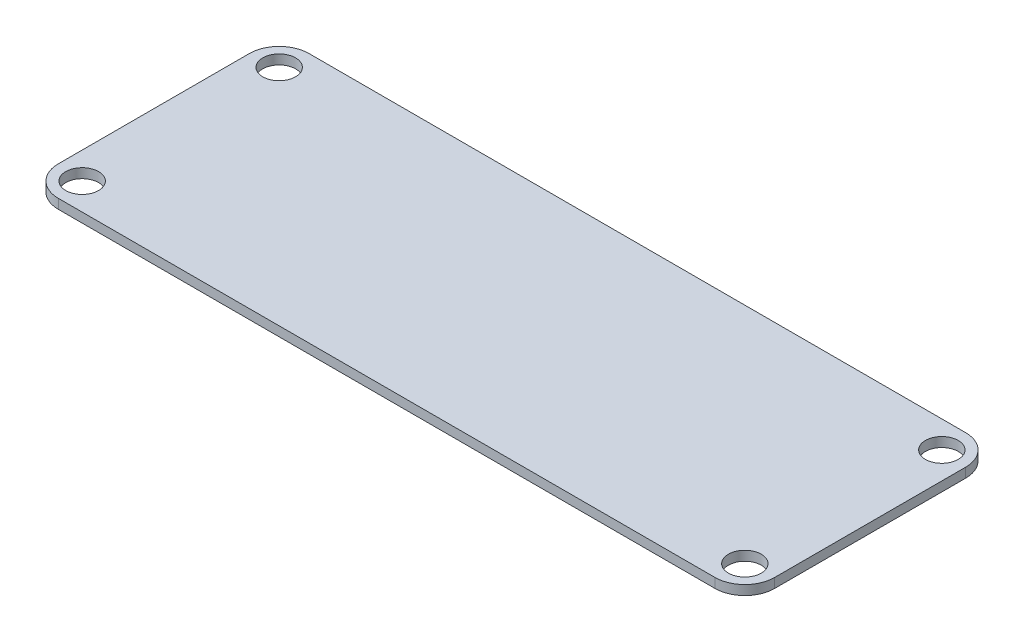
ISO-10303-21;
HEADER;
FILE_DESCRIPTION(('STEP AP214'),'2;1');
FILE_NAME('part.step','',(''),(''),'','','');
FILE_SCHEMA(('AUTOMOTIVE_DESIGN { 1 0 10303 214 1 1 1 1 }'));
ENDSEC;
DATA;
#1=APPLICATION_CONTEXT('core data for automotive mechanical design processes');
#2=APPLICATION_PROTOCOL_DEFINITION('international standard','automotive_design',2000,#1);
#3=PRODUCT_CONTEXT('',#1,'mechanical');
#4=PRODUCT('Part','Part','',(#3));
#5=PRODUCT_RELATED_PRODUCT_CATEGORY('part','',(#4));
#6=PRODUCT_DEFINITION_FORMATION('','',#4);
#7=PRODUCT_DEFINITION_CONTEXT('part definition',#1,'design');
#8=PRODUCT_DEFINITION('design','',#6,#7);
#9=PRODUCT_DEFINITION_SHAPE('','',#8);
#10=(LENGTH_UNIT() NAMED_UNIT(*) SI_UNIT(.MILLI.,.METRE.));
#11=(NAMED_UNIT(*) PLANE_ANGLE_UNIT() SI_UNIT($,.RADIAN.));
#12=(NAMED_UNIT(*) SI_UNIT($,.STERADIAN.) SOLID_ANGLE_UNIT());
#13=UNCERTAINTY_MEASURE_WITH_UNIT(LENGTH_MEASURE(1.E-05),#10,'distance_accuracy_value','');
#14=(GEOMETRIC_REPRESENTATION_CONTEXT(3) GLOBAL_UNCERTAINTY_ASSIGNED_CONTEXT((#13)) GLOBAL_UNIT_ASSIGNED_CONTEXT((#10,
#11,#12)) REPRESENTATION_CONTEXT('',''));
#15=CARTESIAN_POINT('',(0.,0.,0.));
#16=DIRECTION('',(0.,0.,1.));
#17=DIRECTION('',(1.,0.,0.));
#18=AXIS2_PLACEMENT_3D('',#15,#16,#17);
#19=CARTESIAN_POINT('',(-55.,1.6,16.));
#20=DIRECTION('',(0.,-1.,0.));
#21=DIRECTION('',(0.,0.,-1.));
#22=AXIS2_PLACEMENT_3D('',#19,#20,#21);
#23=CYLINDRICAL_SURFACE('',#22,5.);
#24=CARTESIAN_POINT('',(-55.,0.,16.));
#25=DIRECTION('',(0.,1.,0.));
#26=DIRECTION('',(0.,0.,1.));
#27=AXIS2_PLACEMENT_3D('',#24,#25,#26);
#28=CIRCLE('',#27,5.);
#29=CARTESIAN_POINT('',(-60.,0.,16.));
#30=VERTEX_POINT('',#29);
#31=CARTESIAN_POINT('',(-55.,0.,21.));
#32=VERTEX_POINT('',#31);
#33=EDGE_CURVE('E128',#30,#32,#28,.T.);
#34=ORIENTED_EDGE('',*,*,#33,.T.);
#35=DIRECTION('',(0.,-1.,0.));
#36=VECTOR('',#35,1.);
#37=CARTESIAN_POINT('',(-55.,1.6,21.));
#38=LINE('',#37,#36);
#39=CARTESIAN_POINT('',(-55.,1.6,21.));
#40=VERTEX_POINT('',#39);
#41=EDGE_CURVE('E11',#40,#32,#38,.T.);
#42=ORIENTED_EDGE('',*,*,#41,.F.);
#43=CARTESIAN_POINT('',(-55.,1.6,16.));
#44=DIRECTION('',(0.,1.,0.));
#45=DIRECTION('',(0.,0.,1.));
#46=AXIS2_PLACEMENT_3D('',#43,#44,#45);
#47=CIRCLE('',#46,5.);
#48=CARTESIAN_POINT('',(-60.,1.6,16.));
#49=VERTEX_POINT('',#48);
#50=EDGE_CURVE('E143',#49,#40,#47,.T.);
#51=ORIENTED_EDGE('',*,*,#50,.F.);
#52=DIRECTION('',(0.,-1.,0.));
#53=VECTOR('',#52,1.);
#54=CARTESIAN_POINT('',(-60.,1.6,16.));
#55=LINE('',#54,#53);
#56=EDGE_CURVE('E124',#49,#30,#55,.T.);
#57=ORIENTED_EDGE('',*,*,#56,.T.);
#58=EDGE_LOOP('',(#34,#42,#51,#57));
#59=FACE_BOUND('',#58,.T.);
#60=ADVANCED_FACE('F32',(#59),#23,.T.);
#61=CARTESIAN_POINT('',(-55.,1.6,21.));
#62=DIRECTION('',(0.,0.,-1.));
#63=DIRECTION('',(-1.,0.,0.));
#64=AXIS2_PLACEMENT_3D('',#61,#62,#63);
#65=PLANE('',#64);
#66=DIRECTION('',(1.,0.,0.));
#67=VECTOR('',#66,1.);
#68=CARTESIAN_POINT('',(-55.,0.,21.));
#69=LINE('',#68,#67);
#70=CARTESIAN_POINT('',(55.,0.,21.));
#71=VERTEX_POINT('',#70);
#72=EDGE_CURVE('E131',#32,#71,#69,.T.);
#73=ORIENTED_EDGE('',*,*,#72,.T.);
#74=DIRECTION('',(0.,-1.,0.));
#75=VECTOR('',#74,1.);
#76=CARTESIAN_POINT('',(55.,1.6,21.));
#77=LINE('',#76,#75);
#78=CARTESIAN_POINT('',(55.,1.6,21.));
#79=VERTEX_POINT('',#78);
#80=EDGE_CURVE('E40',#79,#71,#77,.T.);
#81=ORIENTED_EDGE('',*,*,#80,.F.);
#82=DIRECTION('',(1.,0.,0.));
#83=VECTOR('',#82,1.);
#84=CARTESIAN_POINT('',(-55.,1.6,21.));
#85=LINE('',#84,#83);
#86=EDGE_CURVE('E91',#40,#79,#85,.T.);
#87=ORIENTED_EDGE('',*,*,#86,.F.);
#88=ORIENTED_EDGE('',*,*,#41,.T.);
#89=EDGE_LOOP('',(#73,#81,#87,#88));
#90=FACE_BOUND('',#89,.T.);
#91=ADVANCED_FACE('F229',(#90),#65,.F.);
#92=CARTESIAN_POINT('',(55.,1.6,16.));
#93=DIRECTION('',(0.,-1.,0.));
#94=DIRECTION('',(0.,0.,-1.));
#95=AXIS2_PLACEMENT_3D('',#92,#93,#94);
#96=CYLINDRICAL_SURFACE('',#95,5.);
#97=CARTESIAN_POINT('',(55.,0.,16.));
#98=DIRECTION('',(0.,1.,0.));
#99=DIRECTION('',(0.,0.,1.));
#100=AXIS2_PLACEMENT_3D('',#97,#98,#99);
#101=CIRCLE('',#100,5.);
#102=CARTESIAN_POINT('',(60.,0.,16.));
#103=VERTEX_POINT('',#102);
#104=EDGE_CURVE('E134',#71,#103,#101,.T.);
#105=ORIENTED_EDGE('',*,*,#104,.T.);
#106=DIRECTION('',(0.,-1.,0.));
#107=VECTOR('',#106,1.);
#108=CARTESIAN_POINT('',(60.,1.6,16.));
#109=LINE('',#108,#107);
#110=CARTESIAN_POINT('',(60.,1.6,16.));
#111=VERTEX_POINT('',#110);
#112=EDGE_CURVE('E150',#111,#103,#109,.T.);
#113=ORIENTED_EDGE('',*,*,#112,.F.);
#114=CARTESIAN_POINT('',(55.,1.6,16.));
#115=DIRECTION('',(0.,1.,0.));
#116=DIRECTION('',(0.,0.,1.));
#117=AXIS2_PLACEMENT_3D('',#114,#115,#116);
#118=CIRCLE('',#117,5.);
#119=EDGE_CURVE('E158',#79,#111,#118,.T.);
#120=ORIENTED_EDGE('',*,*,#119,.F.);
#121=ORIENTED_EDGE('',*,*,#80,.T.);
#122=EDGE_LOOP('',(#105,#113,#120,#121));
#123=FACE_BOUND('',#122,.T.);
#124=ADVANCED_FACE('F156',(#123),#96,.T.);
#125=CARTESIAN_POINT('',(60.,1.6,-16.));
#126=DIRECTION('',(-1.,0.,0.));
#127=DIRECTION('',(0.,0.,1.));
#128=AXIS2_PLACEMENT_3D('',#125,#126,#127);
#129=PLANE('',#128);
#130=DIRECTION('',(0.,0.,-1.));
#131=VECTOR('',#130,1.);
#132=CARTESIAN_POINT('',(60.,0.,-16.));
#133=LINE('',#132,#131);
#134=CARTESIAN_POINT('',(60.,0.,-16.));
#135=VERTEX_POINT('',#134);
#136=EDGE_CURVE('E136',#103,#135,#133,.T.);
#137=ORIENTED_EDGE('',*,*,#136,.T.);
#138=DIRECTION('',(0.,-1.,0.));
#139=VECTOR('',#138,1.);
#140=CARTESIAN_POINT('',(60.,1.6,-16.));
#141=LINE('',#140,#139);
#142=CARTESIAN_POINT('',(60.,1.6,-16.));
#143=VERTEX_POINT('',#142);
#144=EDGE_CURVE('E147',#143,#135,#141,.T.);
#145=ORIENTED_EDGE('',*,*,#144,.F.);
#146=DIRECTION('',(0.,0.,-1.));
#147=VECTOR('',#146,1.);
#148=CARTESIAN_POINT('',(60.,1.6,-16.));
#149=LINE('',#148,#147);
#150=EDGE_CURVE('E170',#111,#143,#149,.T.);
#151=ORIENTED_EDGE('',*,*,#150,.F.);
#152=ORIENTED_EDGE('',*,*,#112,.T.);
#153=EDGE_LOOP('',(#137,#145,#151,#152));
#154=FACE_BOUND('',#153,.T.);
#155=ADVANCED_FACE('F166',(#154),#129,.F.);
#156=CARTESIAN_POINT('',(55.,1.6,-16.));
#157=DIRECTION('',(0.,-1.,0.));
#158=DIRECTION('',(0.,0.,-1.));
#159=AXIS2_PLACEMENT_3D('',#156,#157,#158);
#160=CYLINDRICAL_SURFACE('',#159,5.);
#161=CARTESIAN_POINT('',(55.,0.,-16.));
#162=DIRECTION('',(0.,1.,0.));
#163=DIRECTION('',(0.,0.,-1.));
#164=AXIS2_PLACEMENT_3D('',#161,#162,#163);
#165=CIRCLE('',#164,5.);
#166=CARTESIAN_POINT('',(55.,0.,-21.));
#167=VERTEX_POINT('',#166);
#168=EDGE_CURVE('E138',#135,#167,#165,.T.);
#169=ORIENTED_EDGE('',*,*,#168,.T.);
#170=DIRECTION('',(0.,-1.,0.));
#171=VECTOR('',#170,1.);
#172=CARTESIAN_POINT('',(55.,1.6,-21.));
#173=LINE('',#172,#171);
#174=CARTESIAN_POINT('',(55.,1.6,-21.));
#175=VERTEX_POINT('',#174);
#176=EDGE_CURVE('E119',#175,#167,#173,.T.);
#177=ORIENTED_EDGE('',*,*,#176,.F.);
#178=CARTESIAN_POINT('',(55.,1.6,-16.));
#179=DIRECTION('',(0.,1.,0.));
#180=DIRECTION('',(0.,0.,-1.));
#181=AXIS2_PLACEMENT_3D('',#178,#179,#180);
#182=CIRCLE('',#181,5.);
#183=EDGE_CURVE('E110',#143,#175,#182,.T.);
#184=ORIENTED_EDGE('',*,*,#183,.F.);
#185=ORIENTED_EDGE('',*,*,#144,.T.);
#186=EDGE_LOOP('',(#169,#177,#184,#185));
#187=FACE_BOUND('',#186,.T.);
#188=ADVANCED_FACE('F169',(#187),#160,.T.);
#189=CARTESIAN_POINT('',(-55.,1.6,-21.));
#190=DIRECTION('',(0.,0.,1.));
#191=DIRECTION('',(1.,0.,0.));
#192=AXIS2_PLACEMENT_3D('',#189,#190,#191);
#193=PLANE('',#192);
#194=DIRECTION('',(-1.,0.,0.));
#195=VECTOR('',#194,1.);
#196=CARTESIAN_POINT('',(-55.,0.,-21.));
#197=LINE('',#196,#195);
#198=CARTESIAN_POINT('',(-55.,0.,-21.));
#199=VERTEX_POINT('',#198);
#200=EDGE_CURVE('E118',#167,#199,#197,.T.);
#201=ORIENTED_EDGE('',*,*,#200,.T.);
#202=DIRECTION('',(0.,-1.,0.));
#203=VECTOR('',#202,1.);
#204=CARTESIAN_POINT('',(-55.,1.6,-21.));
#205=LINE('',#204,#203);
#206=CARTESIAN_POINT('',(-55.,1.6,-21.));
#207=VERTEX_POINT('',#206);
#208=EDGE_CURVE('E115',#207,#199,#205,.T.);
#209=ORIENTED_EDGE('',*,*,#208,.F.);
#210=DIRECTION('',(-1.,0.,0.));
#211=VECTOR('',#210,1.);
#212=CARTESIAN_POINT('',(-55.,1.6,-21.));
#213=LINE('',#212,#211);
#214=EDGE_CURVE('E104',#175,#207,#213,.T.);
#215=ORIENTED_EDGE('',*,*,#214,.F.);
#216=ORIENTED_EDGE('',*,*,#176,.T.);
#217=EDGE_LOOP('',(#201,#209,#215,#216));
#218=FACE_BOUND('',#217,.T.);
#219=ADVANCED_FACE('F116',(#218),#193,.F.);
#220=CARTESIAN_POINT('',(-55.,1.6,-16.));
#221=DIRECTION('',(0.,-1.,0.));
#222=DIRECTION('',(0.,0.,-1.));
#223=AXIS2_PLACEMENT_3D('',#220,#221,#222);
#224=CYLINDRICAL_SURFACE('',#223,5.);
#225=CARTESIAN_POINT('',(-55.,0.,-16.));
#226=DIRECTION('',(0.,1.,0.));
#227=DIRECTION('',(0.,0.,1.));
#228=AXIS2_PLACEMENT_3D('',#225,#226,#227);
#229=CIRCLE('',#228,5.);
#230=CARTESIAN_POINT('',(-60.,0.,-16.));
#231=VERTEX_POINT('',#230);
#232=EDGE_CURVE('E77',#199,#231,#229,.T.);
#233=ORIENTED_EDGE('',*,*,#232,.T.);
#234=DIRECTION('',(0.,-1.,0.));
#235=VECTOR('',#234,1.);
#236=CARTESIAN_POINT('',(-60.,1.6,-16.));
#237=LINE('',#236,#235);
#238=CARTESIAN_POINT('',(-60.,1.6,-16.));
#239=VERTEX_POINT('',#238);
#240=EDGE_CURVE('E120',#239,#231,#237,.T.);
#241=ORIENTED_EDGE('',*,*,#240,.F.);
#242=CARTESIAN_POINT('',(-55.,1.6,-16.));
#243=DIRECTION('',(0.,1.,0.));
#244=DIRECTION('',(0.,0.,1.));
#245=AXIS2_PLACEMENT_3D('',#242,#243,#244);
#246=CIRCLE('',#245,5.);
#247=EDGE_CURVE('E108',#207,#239,#246,.T.);
#248=ORIENTED_EDGE('',*,*,#247,.F.);
#249=ORIENTED_EDGE('',*,*,#208,.T.);
#250=EDGE_LOOP('',(#233,#241,#248,#249));
#251=FACE_BOUND('',#250,.T.);
#252=ADVANCED_FACE('F122',(#251),#224,.T.);
#253=CARTESIAN_POINT('',(-60.,1.6,-16.));
#254=DIRECTION('',(1.,0.,0.));
#255=DIRECTION('',(0.,0.,-1.));
#256=AXIS2_PLACEMENT_3D('',#253,#254,#255);
#257=PLANE('',#256);
#258=DIRECTION('',(0.,0.,1.));
#259=VECTOR('',#258,1.);
#260=CARTESIAN_POINT('',(-60.,0.,-16.));
#261=LINE('',#260,#259);
#262=EDGE_CURVE('E83',#231,#30,#261,.T.);
#263=ORIENTED_EDGE('',*,*,#262,.T.);
#264=ORIENTED_EDGE('',*,*,#56,.F.);
#265=DIRECTION('',(0.,0.,1.));
#266=VECTOR('',#265,1.);
#267=CARTESIAN_POINT('',(-60.,1.6,-16.));
#268=LINE('',#267,#266);
#269=EDGE_CURVE('E48',#239,#49,#268,.T.);
#270=ORIENTED_EDGE('',*,*,#269,.F.);
#271=ORIENTED_EDGE('',*,*,#240,.T.);
#272=EDGE_LOOP('',(#263,#264,#270,#271));
#273=FACE_BOUND('',#272,.T.);
#274=ADVANCED_FACE('F212',(#273),#257,.F.);
#275=CARTESIAN_POINT('',(-55.,1.6,16.));
#276=DIRECTION('',(0.,1.,0.));
#277=DIRECTION('',(0.,0.,1.));
#278=AXIS2_PLACEMENT_3D('',#275,#276,#277);
#279=PLANE('',#278);
#280=CARTESIAN_POINT('',(-55.5,1.6,16.5));
#281=DIRECTION('',(0.,1.,0.));
#282=DIRECTION('',(0.,0.,1.));
#283=AXIS2_PLACEMENT_3D('',#280,#281,#282);
#284=CIRCLE('',#283,2.75);
#285=CARTESIAN_POINT('',(-55.5,1.6,19.25));
#286=VERTEX_POINT('',#285);
#287=EDGE_CURVE('E189',#286,#286,#284,.T.);
#288=ORIENTED_EDGE('',*,*,#287,.F.);
#289=EDGE_LOOP('',(#288));
#290=FACE_BOUND('',#289,.T.);
#291=CARTESIAN_POINT('',(55.5,1.6,-16.5));
#292=DIRECTION('',(0.,1.,0.));
#293=DIRECTION('',(0.,0.,1.));
#294=AXIS2_PLACEMENT_3D('',#291,#292,#293);
#295=CIRCLE('',#294,2.75);
#296=CARTESIAN_POINT('',(55.5,1.6,-13.75));
#297=VERTEX_POINT('',#296);
#298=EDGE_CURVE('E182',#297,#297,#295,.T.);
#299=ORIENTED_EDGE('',*,*,#298,.F.);
#300=EDGE_LOOP('',(#299));
#301=FACE_BOUND('',#300,.T.);
#302=CARTESIAN_POINT('',(55.5,1.6,16.5));
#303=DIRECTION('',(0.,1.,0.));
#304=DIRECTION('',(0.,0.,1.));
#305=AXIS2_PLACEMENT_3D('',#302,#303,#304);
#306=CIRCLE('',#305,2.75);
#307=CARTESIAN_POINT('',(55.5,1.6,19.25));
#308=VERTEX_POINT('',#307);
#309=EDGE_CURVE('E194',#308,#308,#306,.T.);
#310=ORIENTED_EDGE('',*,*,#309,.F.);
#311=EDGE_LOOP('',(#310));
#312=FACE_BOUND('',#311,.T.);
#313=CARTESIAN_POINT('',(-55.5,1.6,-16.5));
#314=DIRECTION('',(0.,1.,0.));
#315=DIRECTION('',(0.,0.,1.));
#316=AXIS2_PLACEMENT_3D('',#313,#314,#315);
#317=CIRCLE('',#316,2.75);
#318=CARTESIAN_POINT('',(-55.5,1.6,-13.75));
#319=VERTEX_POINT('',#318);
#320=EDGE_CURVE('E176',#319,#319,#317,.T.);
#321=ORIENTED_EDGE('',*,*,#320,.F.);
#322=EDGE_LOOP('',(#321));
#323=FACE_BOUND('',#322,.T.);
#324=ORIENTED_EDGE('',*,*,#50,.T.);
#325=ORIENTED_EDGE('',*,*,#86,.T.);
#326=ORIENTED_EDGE('',*,*,#119,.T.);
#327=ORIENTED_EDGE('',*,*,#150,.T.);
#328=ORIENTED_EDGE('',*,*,#183,.T.);
#329=ORIENTED_EDGE('',*,*,#214,.T.);
#330=ORIENTED_EDGE('',*,*,#247,.T.);
#331=ORIENTED_EDGE('',*,*,#269,.T.);
#332=EDGE_LOOP('',(#324,#325,#326,#327,#328,#329,#330,#331));
#333=FACE_BOUND('',#332,.T.);
#334=ADVANCED_FACE('F106',(#290,#301,#312,#323,#333),#279,.T.);
#335=CARTESIAN_POINT('',(-55.,0.,16.));
#336=DIRECTION('',(0.,1.,0.));
#337=DIRECTION('',(0.,0.,1.));
#338=AXIS2_PLACEMENT_3D('',#335,#336,#337);
#339=PLANE('',#338);
#340=CARTESIAN_POINT('',(-55.5,0.,16.5));
#341=DIRECTION('',(0.,1.,0.));
#342=DIRECTION('',(0.,0.,1.));
#343=AXIS2_PLACEMENT_3D('',#340,#341,#342);
#344=CIRCLE('',#343,2.75);
#345=CARTESIAN_POINT('',(-55.5,0.,19.25));
#346=VERTEX_POINT('',#345);
#347=EDGE_CURVE('E179',#346,#346,#344,.T.);
#348=ORIENTED_EDGE('',*,*,#347,.T.);
#349=EDGE_LOOP('',(#348));
#350=FACE_BOUND('',#349,.T.);
#351=CARTESIAN_POINT('',(55.5,0.,-16.5));
#352=DIRECTION('',(0.,1.,0.));
#353=DIRECTION('',(0.,0.,1.));
#354=AXIS2_PLACEMENT_3D('',#351,#352,#353);
#355=CIRCLE('',#354,2.75);
#356=CARTESIAN_POINT('',(55.5,0.,-13.75));
#357=VERTEX_POINT('',#356);
#358=EDGE_CURVE('E185',#357,#357,#355,.T.);
#359=ORIENTED_EDGE('',*,*,#358,.T.);
#360=EDGE_LOOP('',(#359));
#361=FACE_BOUND('',#360,.T.);
#362=CARTESIAN_POINT('',(55.5,0.,16.5));
#363=DIRECTION('',(0.,1.,0.));
#364=DIRECTION('',(0.,0.,1.));
#365=AXIS2_PLACEMENT_3D('',#362,#363,#364);
#366=CIRCLE('',#365,2.75);
#367=CARTESIAN_POINT('',(55.5,0.,19.25));
#368=VERTEX_POINT('',#367);
#369=EDGE_CURVE('E186',#368,#368,#366,.T.);
#370=ORIENTED_EDGE('',*,*,#369,.T.);
#371=EDGE_LOOP('',(#370));
#372=FACE_BOUND('',#371,.T.);
#373=CARTESIAN_POINT('',(-55.5,0.,-16.5));
#374=DIRECTION('',(0.,1.,0.));
#375=DIRECTION('',(0.,0.,1.));
#376=AXIS2_PLACEMENT_3D('',#373,#374,#375);
#377=CIRCLE('',#376,2.75);
#378=CARTESIAN_POINT('',(-55.5,0.,-13.75));
#379=VERTEX_POINT('',#378);
#380=EDGE_CURVE('E132',#379,#379,#377,.T.);
#381=ORIENTED_EDGE('',*,*,#380,.T.);
#382=EDGE_LOOP('',(#381));
#383=FACE_BOUND('',#382,.T.);
#384=ORIENTED_EDGE('',*,*,#33,.F.);
#385=ORIENTED_EDGE('',*,*,#262,.F.);
#386=ORIENTED_EDGE('',*,*,#232,.F.);
#387=ORIENTED_EDGE('',*,*,#200,.F.);
#388=ORIENTED_EDGE('',*,*,#168,.F.);
#389=ORIENTED_EDGE('',*,*,#136,.F.);
#390=ORIENTED_EDGE('',*,*,#104,.F.);
#391=ORIENTED_EDGE('',*,*,#72,.F.);
#392=EDGE_LOOP('',(#384,#385,#386,#387,#388,#389,#390,#391));
#393=FACE_BOUND('',#392,.T.);
#394=ADVANCED_FACE('F162',(#350,#361,#372,#383,#393),#339,.F.);
#395=CARTESIAN_POINT('',(-55.5,0.,-16.5));
#396=DIRECTION('',(0.,1.,0.));
#397=DIRECTION('',(0.,0.,1.));
#398=AXIS2_PLACEMENT_3D('',#395,#396,#397);
#399=CYLINDRICAL_SURFACE('',#398,2.75);
#400=ORIENTED_EDGE('',*,*,#380,.F.);
#401=EDGE_LOOP('',(#400));
#402=FACE_BOUND('',#401,.T.);
#403=ORIENTED_EDGE('',*,*,#320,.T.);
#404=EDGE_LOOP('',(#403));
#405=FACE_BOUND('',#404,.T.);
#406=ADVANCED_FACE('F206',(#402,#405),#399,.F.);
#407=CARTESIAN_POINT('',(55.5,0.,16.5));
#408=DIRECTION('',(0.,1.,0.));
#409=DIRECTION('',(0.,0.,1.));
#410=AXIS2_PLACEMENT_3D('',#407,#408,#409);
#411=CYLINDRICAL_SURFACE('',#410,2.75);
#412=ORIENTED_EDGE('',*,*,#369,.F.);
#413=EDGE_LOOP('',(#412));
#414=FACE_BOUND('',#413,.T.);
#415=ORIENTED_EDGE('',*,*,#309,.T.);
#416=EDGE_LOOP('',(#415));
#417=FACE_BOUND('',#416,.T.);
#418=ADVANCED_FACE('F202',(#414,#417),#411,.F.);
#419=CARTESIAN_POINT('',(55.5,0.,-16.5));
#420=DIRECTION('',(0.,1.,0.));
#421=DIRECTION('',(0.,0.,1.));
#422=AXIS2_PLACEMENT_3D('',#419,#420,#421);
#423=CYLINDRICAL_SURFACE('',#422,2.75);
#424=ORIENTED_EDGE('',*,*,#358,.F.);
#425=EDGE_LOOP('',(#424));
#426=FACE_BOUND('',#425,.T.);
#427=ORIENTED_EDGE('',*,*,#298,.T.);
#428=EDGE_LOOP('',(#427));
#429=FACE_BOUND('',#428,.T.);
#430=ADVANCED_FACE('F205',(#426,#429),#423,.F.);
#431=CARTESIAN_POINT('',(-55.5,0.,16.5));
#432=DIRECTION('',(0.,1.,0.));
#433=DIRECTION('',(0.,0.,1.));
#434=AXIS2_PLACEMENT_3D('',#431,#432,#433);
#435=CYLINDRICAL_SURFACE('',#434,2.75);
#436=ORIENTED_EDGE('',*,*,#347,.F.);
#437=EDGE_LOOP('',(#436));
#438=FACE_BOUND('',#437,.T.);
#439=ORIENTED_EDGE('',*,*,#287,.T.);
#440=EDGE_LOOP('',(#439));
#441=FACE_BOUND('',#440,.T.);
#442=ADVANCED_FACE('F300',(#438,#441),#435,.F.);
#443=CLOSED_SHELL('',(#60,#91,#124,#155,#188,#219,#252,#274,#334,#394,#406,#418,#430,#442));
#444=MANIFOLD_SOLID_BREP('B2',#443);
#445=ADVANCED_BREP_SHAPE_REPRESENTATION('',(#18,#444),#14);
#446=SHAPE_DEFINITION_REPRESENTATION(#9,#445);
ENDSEC;
END-ISO-10303-21;
